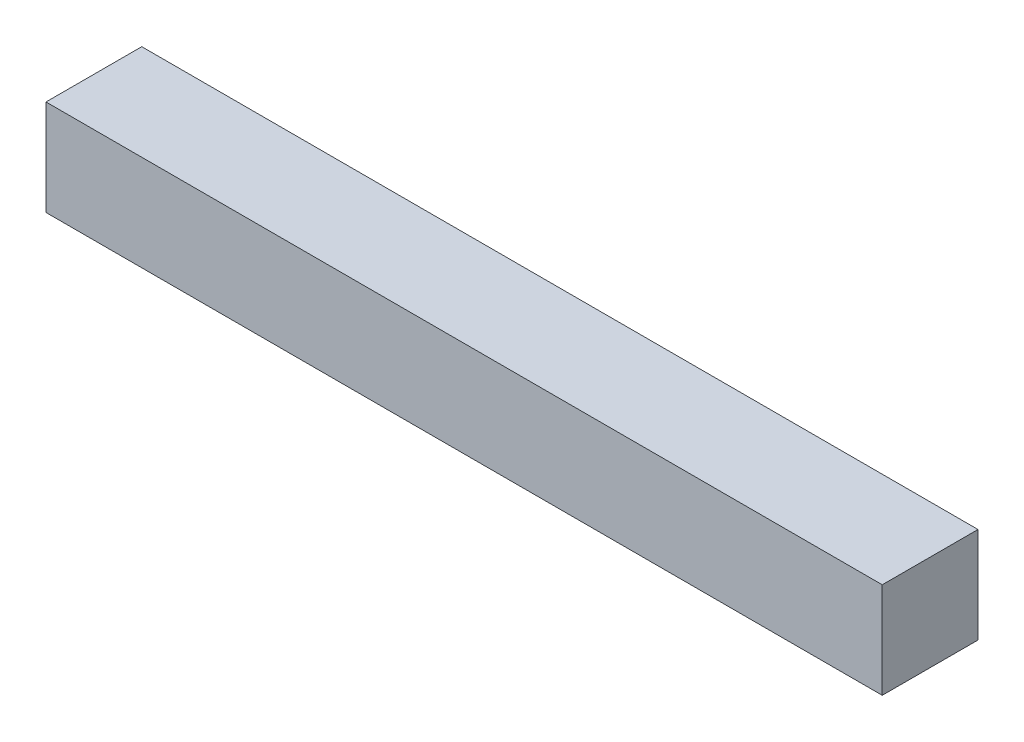
ISO-10303-21;
HEADER;
FILE_DESCRIPTION(('STEP AP214'),'2;1');
FILE_NAME('part.step','',(''),(''),'','','');
FILE_SCHEMA(('AUTOMOTIVE_DESIGN { 1 0 10303 214 1 1 1 1 }'));
ENDSEC;
DATA;
#1=APPLICATION_CONTEXT('core data for automotive mechanical design processes');
#2=APPLICATION_PROTOCOL_DEFINITION('international standard','automotive_design',2000,#1);
#3=PRODUCT_CONTEXT('',#1,'mechanical');
#4=PRODUCT('Part','Part','',(#3));
#5=PRODUCT_RELATED_PRODUCT_CATEGORY('part','',(#4));
#6=PRODUCT_DEFINITION_FORMATION('','',#4);
#7=PRODUCT_DEFINITION_CONTEXT('part definition',#1,'design');
#8=PRODUCT_DEFINITION('design','',#6,#7);
#9=PRODUCT_DEFINITION_SHAPE('','',#8);
#10=(LENGTH_UNIT() NAMED_UNIT(*) SI_UNIT(.MILLI.,.METRE.));
#11=(NAMED_UNIT(*) PLANE_ANGLE_UNIT() SI_UNIT($,.RADIAN.));
#12=(NAMED_UNIT(*) SI_UNIT($,.STERADIAN.) SOLID_ANGLE_UNIT());
#13=UNCERTAINTY_MEASURE_WITH_UNIT(LENGTH_MEASURE(1.E-05),#10,'distance_accuracy_value','');
#14=(GEOMETRIC_REPRESENTATION_CONTEXT(3) GLOBAL_UNCERTAINTY_ASSIGNED_CONTEXT((#13)) GLOBAL_UNIT_ASSIGNED_CONTEXT((#10,
#11,#12)) REPRESENTATION_CONTEXT('',''));
#15=CARTESIAN_POINT('',(0.,0.,0.));
#16=DIRECTION('',(0.,0.,1.));
#17=DIRECTION('',(1.,0.,0.));
#18=AXIS2_PLACEMENT_3D('',#15,#16,#17);
#19=CARTESIAN_POINT('',(0.,30.,0.));
#20=DIRECTION('',(1.,0.,0.));
#21=DIRECTION('',(0.,0.,-1.));
#22=AXIS2_PLACEMENT_3D('',#19,#20,#21);
#23=PLANE('',#22);
#24=DIRECTION('',(0.,0.,1.));
#25=VECTOR('',#24,1.);
#26=CARTESIAN_POINT('',(0.,0.,0.));
#27=LINE('',#26,#25);
#28=CARTESIAN_POINT('',(0.,0.,-30.));
#29=VERTEX_POINT('',#28);
#30=CARTESIAN_POINT('',(0.,0.,0.));
#31=VERTEX_POINT('',#30);
#32=EDGE_CURVE('E107',#29,#31,#27,.T.);
#33=ORIENTED_EDGE('',*,*,#32,.T.);
#34=DIRECTION('',(0.,-1.,0.));
#35=VECTOR('',#34,1.);
#36=CARTESIAN_POINT('',(0.,30.,0.));
#37=LINE('',#36,#35);
#38=CARTESIAN_POINT('',(0.,30.,0.));
#39=VERTEX_POINT('',#38);
#40=EDGE_CURVE('E11',#39,#31,#37,.T.);
#41=ORIENTED_EDGE('',*,*,#40,.F.);
#42=DIRECTION('',(0.,0.,1.));
#43=VECTOR('',#42,1.);
#44=CARTESIAN_POINT('',(0.,30.,0.));
#45=LINE('',#44,#43);
#46=CARTESIAN_POINT('',(0.,30.,-30.));
#47=VERTEX_POINT('',#46);
#48=EDGE_CURVE('E91',#47,#39,#45,.T.);
#49=ORIENTED_EDGE('',*,*,#48,.F.);
#50=DIRECTION('',(0.,-1.,0.));
#51=VECTOR('',#50,1.);
#52=CARTESIAN_POINT('',(0.,30.,-30.));
#53=LINE('',#52,#51);
#54=EDGE_CURVE('E103',#47,#29,#53,.T.);
#55=ORIENTED_EDGE('',*,*,#54,.T.);
#56=EDGE_LOOP('',(#33,#41,#49,#55));
#57=FACE_BOUND('',#56,.T.);
#58=ADVANCED_FACE('F39',(#57),#23,.F.);
#59=CARTESIAN_POINT('',(0.,30.,0.));
#60=DIRECTION('',(0.,0.,-1.));
#61=DIRECTION('',(-1.,0.,0.));
#62=AXIS2_PLACEMENT_3D('',#59,#60,#61);
#63=PLANE('',#62);
#64=DIRECTION('',(1.,0.,0.));
#65=VECTOR('',#64,1.);
#66=CARTESIAN_POINT('',(0.,0.,0.));
#67=LINE('',#66,#65);
#68=CARTESIAN_POINT('',(262.,0.,0.));
#69=VERTEX_POINT('',#68);
#70=EDGE_CURVE('E96',#31,#69,#67,.T.);
#71=ORIENTED_EDGE('',*,*,#70,.T.);
#72=DIRECTION('',(0.,-1.,0.));
#73=VECTOR('',#72,1.);
#74=CARTESIAN_POINT('',(262.,30.,0.));
#75=LINE('',#74,#73);
#76=CARTESIAN_POINT('',(262.,30.,0.));
#77=VERTEX_POINT('',#76);
#78=EDGE_CURVE('E48',#77,#69,#75,.T.);
#79=ORIENTED_EDGE('',*,*,#78,.F.);
#80=DIRECTION('',(1.,0.,0.));
#81=VECTOR('',#80,1.);
#82=CARTESIAN_POINT('',(0.,30.,0.));
#83=LINE('',#82,#81);
#84=EDGE_CURVE('E86',#39,#77,#83,.T.);
#85=ORIENTED_EDGE('',*,*,#84,.F.);
#86=ORIENTED_EDGE('',*,*,#40,.T.);
#87=EDGE_LOOP('',(#71,#79,#85,#86));
#88=FACE_BOUND('',#87,.T.);
#89=ADVANCED_FACE('F95',(#88),#63,.F.);
#90=CARTESIAN_POINT('',(262.,30.,0.));
#91=DIRECTION('',(-1.,0.,0.));
#92=DIRECTION('',(0.,0.,1.));
#93=AXIS2_PLACEMENT_3D('',#90,#91,#92);
#94=PLANE('',#93);
#95=DIRECTION('',(0.,0.,-1.));
#96=VECTOR('',#95,1.);
#97=CARTESIAN_POINT('',(262.,0.,0.));
#98=LINE('',#97,#96);
#99=CARTESIAN_POINT('',(262.,0.,-30.));
#100=VERTEX_POINT('',#99);
#101=EDGE_CURVE('E73',#69,#100,#98,.T.);
#102=ORIENTED_EDGE('',*,*,#101,.T.);
#103=DIRECTION('',(0.,-1.,0.));
#104=VECTOR('',#103,1.);
#105=CARTESIAN_POINT('',(262.,30.,-30.));
#106=LINE('',#105,#104);
#107=CARTESIAN_POINT('',(262.,30.,-30.));
#108=VERTEX_POINT('',#107);
#109=EDGE_CURVE('E98',#108,#100,#106,.T.);
#110=ORIENTED_EDGE('',*,*,#109,.F.);
#111=DIRECTION('',(0.,0.,-1.));
#112=VECTOR('',#111,1.);
#113=CARTESIAN_POINT('',(262.,30.,0.));
#114=LINE('',#113,#112);
#115=EDGE_CURVE('E89',#77,#108,#114,.T.);
#116=ORIENTED_EDGE('',*,*,#115,.F.);
#117=ORIENTED_EDGE('',*,*,#78,.T.);
#118=EDGE_LOOP('',(#102,#110,#116,#117));
#119=FACE_BOUND('',#118,.T.);
#120=ADVANCED_FACE('F99',(#119),#94,.F.);
#121=CARTESIAN_POINT('',(0.,30.,-30.));
#122=DIRECTION('',(0.,0.,1.));
#123=DIRECTION('',(1.,0.,0.));
#124=AXIS2_PLACEMENT_3D('',#121,#122,#123);
#125=PLANE('',#124);
#126=DIRECTION('',(-1.,0.,0.));
#127=VECTOR('',#126,1.);
#128=CARTESIAN_POINT('',(0.,0.,-30.));
#129=LINE('',#128,#127);
#130=EDGE_CURVE('E79',#100,#29,#129,.T.);
#131=ORIENTED_EDGE('',*,*,#130,.T.);
#132=ORIENTED_EDGE('',*,*,#54,.F.);
#133=DIRECTION('',(-1.,0.,0.));
#134=VECTOR('',#133,1.);
#135=CARTESIAN_POINT('',(0.,30.,-30.));
#136=LINE('',#135,#134);
#137=EDGE_CURVE('E56',#108,#47,#136,.T.);
#138=ORIENTED_EDGE('',*,*,#137,.F.);
#139=ORIENTED_EDGE('',*,*,#109,.T.);
#140=EDGE_LOOP('',(#131,#132,#138,#139));
#141=FACE_BOUND('',#140,.T.);
#142=ADVANCED_FACE('F120',(#141),#125,.F.);
#143=CARTESIAN_POINT('',(0.,30.,0.));
#144=DIRECTION('',(0.,-1.,0.));
#145=DIRECTION('',(0.,0.,-1.));
#146=AXIS2_PLACEMENT_3D('',#143,#144,#145);
#147=PLANE('',#146);
#148=ORIENTED_EDGE('',*,*,#48,.T.);
#149=ORIENTED_EDGE('',*,*,#84,.T.);
#150=ORIENTED_EDGE('',*,*,#115,.T.);
#151=ORIENTED_EDGE('',*,*,#137,.T.);
#152=EDGE_LOOP('',(#148,#149,#150,#151));
#153=FACE_BOUND('',#152,.T.);
#154=ADVANCED_FACE('F87',(#153),#147,.F.);
#155=CARTESIAN_POINT('',(0.,0.,0.));
#156=DIRECTION('',(0.,-1.,0.));
#157=DIRECTION('',(0.,0.,-1.));
#158=AXIS2_PLACEMENT_3D('',#155,#156,#157);
#159=PLANE('',#158);
#160=ORIENTED_EDGE('',*,*,#32,.F.);
#161=ORIENTED_EDGE('',*,*,#130,.F.);
#162=ORIENTED_EDGE('',*,*,#101,.F.);
#163=ORIENTED_EDGE('',*,*,#70,.F.);
#164=EDGE_LOOP('',(#160,#161,#162,#163));
#165=FACE_BOUND('',#164,.T.);
#166=ADVANCED_FACE('F123',(#165),#159,.T.);
#167=CLOSED_SHELL('',(#58,#89,#120,#142,#154,#166));
#168=MANIFOLD_SOLID_BREP('B2',#167);
#169=ADVANCED_BREP_SHAPE_REPRESENTATION('',(#18,#168),#14);
#170=SHAPE_DEFINITION_REPRESENTATION(#9,#169);
ENDSEC;
END-ISO-10303-21;
